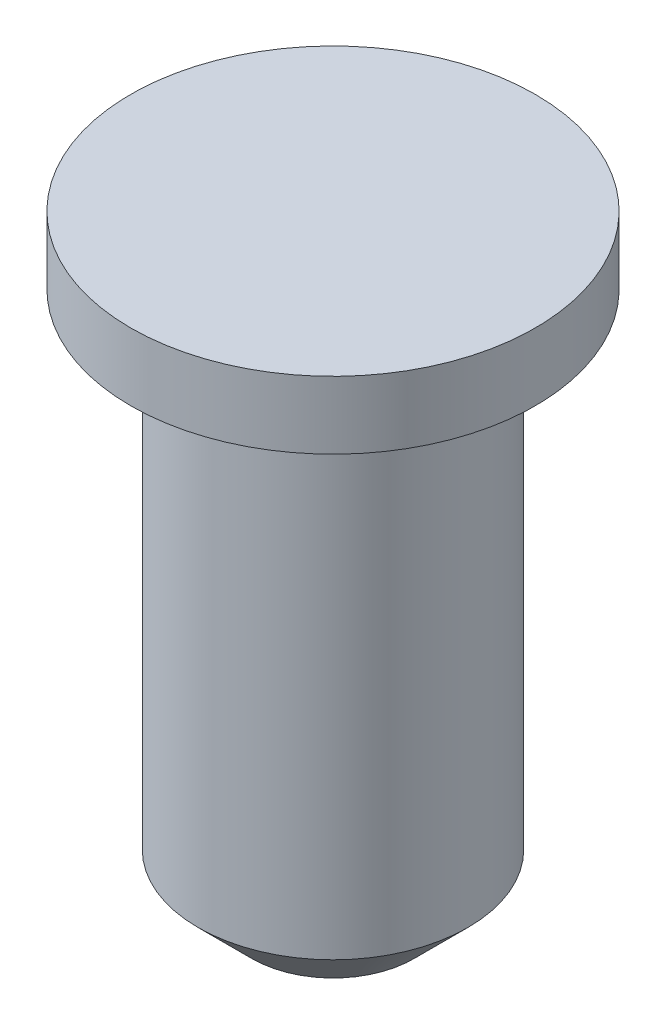
ISO-10303-21;
HEADER;
FILE_DESCRIPTION(('STEP AP214'),'2;1');
FILE_NAME('part.step','',(''),(''),'','','');
FILE_SCHEMA(('AUTOMOTIVE_DESIGN { 1 0 10303 214 1 1 1 1 }'));
ENDSEC;
DATA;
#1=APPLICATION_CONTEXT('core data for automotive mechanical design processes');
#2=APPLICATION_PROTOCOL_DEFINITION('international standard','automotive_design',2000,#1);
#3=PRODUCT_CONTEXT('',#1,'mechanical');
#4=PRODUCT('Part','Part','',(#3));
#5=PRODUCT_RELATED_PRODUCT_CATEGORY('part','',(#4));
#6=PRODUCT_DEFINITION_FORMATION('','',#4);
#7=PRODUCT_DEFINITION_CONTEXT('part definition',#1,'design');
#8=PRODUCT_DEFINITION('design','',#6,#7);
#9=PRODUCT_DEFINITION_SHAPE('','',#8);
#10=(LENGTH_UNIT() NAMED_UNIT(*) SI_UNIT(.MILLI.,.METRE.));
#11=(NAMED_UNIT(*) PLANE_ANGLE_UNIT() SI_UNIT($,.RADIAN.));
#12=(NAMED_UNIT(*) SI_UNIT($,.STERADIAN.) SOLID_ANGLE_UNIT());
#13=UNCERTAINTY_MEASURE_WITH_UNIT(LENGTH_MEASURE(1.E-05),#10,'distance_accuracy_value','');
#14=(GEOMETRIC_REPRESENTATION_CONTEXT(3) GLOBAL_UNCERTAINTY_ASSIGNED_CONTEXT((#13)) GLOBAL_UNIT_ASSIGNED_CONTEXT((#10,
#11,#12)) REPRESENTATION_CONTEXT('',''));
#15=CARTESIAN_POINT('',(0.,0.,0.));
#16=DIRECTION('',(0.,0.,1.));
#17=DIRECTION('',(1.,0.,0.));
#18=AXIS2_PLACEMENT_3D('',#15,#16,#17);
#19=CARTESIAN_POINT('',(0.,8.,0.));
#20=DIRECTION('',(0.,-1.,0.));
#21=DIRECTION('',(0.,0.,-1.));
#22=AXIS2_PLACEMENT_3D('',#19,#20,#21);
#23=CYLINDRICAL_SURFACE('',#22,2.);
#24=CARTESIAN_POINT('',(0.,0.799999999999998,0.));
#25=DIRECTION('',(0.,1.,0.));
#26=DIRECTION('',(0.,0.,1.));
#27=AXIS2_PLACEMENT_3D('',#24,#25,#26);
#28=CIRCLE('',#27,2.);
#29=CARTESIAN_POINT('',(0.,0.799999999999998,2.));
#30=VERTEX_POINT('',#29);
#31=EDGE_CURVE('E41',#30,#30,#28,.T.);
#32=ORIENTED_EDGE('',*,*,#31,.T.);
#33=EDGE_LOOP('',(#32));
#34=FACE_BOUND('',#33,.T.);
#35=CARTESIAN_POINT('',(0.,8.,0.));
#36=DIRECTION('',(0.,1.,0.));
#37=DIRECTION('',(0.,0.,1.));
#38=AXIS2_PLACEMENT_3D('',#35,#36,#37);
#39=CIRCLE('',#38,2.);
#40=CARTESIAN_POINT('',(0.,8.,2.));
#41=VERTEX_POINT('',#40);
#42=EDGE_CURVE('E45',#41,#41,#39,.T.);
#43=ORIENTED_EDGE('',*,*,#42,.F.);
#44=EDGE_LOOP('',(#43));
#45=FACE_BOUND('',#44,.T.);
#46=ADVANCED_FACE('F33',(#34,#45),#23,.T.);
#47=CARTESIAN_POINT('',(0.,0.,0.));
#48=DIRECTION('',(0.,1.,0.));
#49=DIRECTION('',(0.,0.,1.));
#50=AXIS2_PLACEMENT_3D('',#47,#48,#49);
#51=PLANE('',#50);
#52=CARTESIAN_POINT('',(0.,0.,0.));
#53=DIRECTION('',(0.,1.,0.));
#54=DIRECTION('',(0.,0.,1.));
#55=AXIS2_PLACEMENT_3D('',#52,#53,#54);
#56=CIRCLE('',#55,1.2);
#57=CARTESIAN_POINT('',(0.,0.,1.2));
#58=VERTEX_POINT('',#57);
#59=EDGE_CURVE('E10',#58,#58,#56,.F.);
#60=ORIENTED_EDGE('',*,*,#59,.T.);
#61=EDGE_LOOP('',(#60));
#62=FACE_BOUND('',#61,.T.);
#63=ADVANCED_FACE('F63',(#62),#51,.F.);
#64=CARTESIAN_POINT('',(0.,9.,0.));
#65=DIRECTION('',(0.,-1.,0.));
#66=DIRECTION('',(0.,0.,-1.));
#67=AXIS2_PLACEMENT_3D('',#64,#65,#66);
#68=CYLINDRICAL_SURFACE('',#67,3.);
#69=CARTESIAN_POINT('',(0.,9.,0.));
#70=DIRECTION('',(0.,1.,0.));
#71=DIRECTION('',(0.,0.,1.));
#72=AXIS2_PLACEMENT_3D('',#69,#70,#71);
#73=CIRCLE('',#72,3.);
#74=CARTESIAN_POINT('',(0.,9.,3.));
#75=VERTEX_POINT('',#74);
#76=EDGE_CURVE('E49',#75,#75,#73,.T.);
#77=ORIENTED_EDGE('',*,*,#76,.F.);
#78=EDGE_LOOP('',(#77));
#79=FACE_BOUND('',#78,.T.);
#80=CARTESIAN_POINT('',(0.,8.,0.));
#81=DIRECTION('',(0.,1.,0.));
#82=DIRECTION('',(0.,0.,1.));
#83=AXIS2_PLACEMENT_3D('',#80,#81,#82);
#84=CIRCLE('',#83,3.);
#85=CARTESIAN_POINT('',(0.,8.,3.));
#86=VERTEX_POINT('',#85);
#87=EDGE_CURVE('E52',#86,#86,#84,.T.);
#88=ORIENTED_EDGE('',*,*,#87,.T.);
#89=EDGE_LOOP('',(#88));
#90=FACE_BOUND('',#89,.T.);
#91=ADVANCED_FACE('F60',(#79,#90),#68,.T.);
#92=CARTESIAN_POINT('',(0.,9.,0.));
#93=DIRECTION('',(0.,1.,0.));
#94=DIRECTION('',(0.,0.,1.));
#95=AXIS2_PLACEMENT_3D('',#92,#93,#94);
#96=PLANE('',#95);
#97=ORIENTED_EDGE('',*,*,#76,.T.);
#98=EDGE_LOOP('',(#97));
#99=FACE_BOUND('',#98,.T.);
#100=ADVANCED_FACE('F58',(#99),#96,.T.);
#101=CARTESIAN_POINT('',(0.,8.,0.));
#102=DIRECTION('',(0.,1.,0.));
#103=DIRECTION('',(0.,0.,1.));
#104=AXIS2_PLACEMENT_3D('',#101,#102,#103);
#105=PLANE('',#104);
#106=ORIENTED_EDGE('',*,*,#42,.T.);
#107=EDGE_LOOP('',(#106));
#108=FACE_BOUND('',#107,.T.);
#109=ORIENTED_EDGE('',*,*,#87,.F.);
#110=EDGE_LOOP('',(#109));
#111=FACE_BOUND('',#110,.T.);
#112=ADVANCED_FACE('F67',(#108,#111),#105,.F.);
#113=CARTESIAN_POINT('',(0.,0.799999999999998,0.));
#114=DIRECTION('',(0.,1.,0.));
#115=DIRECTION('',(0.,0.,1.));
#116=AXIS2_PLACEMENT_3D('',#113,#114,#115);
#117=CONICAL_SURFACE('',#116,2.,0.78539816339745);
#118=CARTESIAN_POINT('',(0.,0.,1.2));
#119=CARTESIAN_POINT('',(0.,0.00833333333333311,1.20833333333333));
#120=CARTESIAN_POINT('',(0.,0.0166666666666665,1.21666666666667));
#121=CARTESIAN_POINT('',(0.,0.0333333333333332,1.23333333333333));
#122=CARTESIAN_POINT('',(0.,0.0416666666666665,1.24166666666667));
#123=CARTESIAN_POINT('',(0.,0.0583333333333331,1.25833333333333));
#124=CARTESIAN_POINT('',(0.,0.0666666666666664,1.26666666666667));
#125=CARTESIAN_POINT('',(0.,0.083333333333333,1.28333333333333));
#126=CARTESIAN_POINT('',(0.,0.0916666666666663,1.29166666666667));
#127=CARTESIAN_POINT('',(0.,0.108333333333333,1.30833333333333));
#128=CARTESIAN_POINT('',(0.,0.116666666666666,1.31666666666667));
#129=CARTESIAN_POINT('',(0.,0.133333333333333,1.33333333333333));
#130=CARTESIAN_POINT('',(0.,0.141666666666666,1.34166666666667));
#131=CARTESIAN_POINT('',(0.,0.158333333333333,1.35833333333333));
#132=CARTESIAN_POINT('',(0.,0.166666666666666,1.36666666666667));
#133=CARTESIAN_POINT('',(0.,0.183333333333333,1.38333333333333));
#134=CARTESIAN_POINT('',(0.,0.191666666666666,1.39166666666667));
#135=CARTESIAN_POINT('',(0.,0.208333333333333,1.40833333333333));
#136=CARTESIAN_POINT('',(0.,0.216666666666666,1.41666666666667));
#137=CARTESIAN_POINT('',(0.,0.233333333333333,1.43333333333333));
#138=CARTESIAN_POINT('',(0.,0.241666666666666,1.44166666666667));
#139=CARTESIAN_POINT('',(0.,0.258333333333332,1.45833333333333));
#140=CARTESIAN_POINT('',(0.,0.266666666666666,1.46666666666667));
#141=CARTESIAN_POINT('',(0.,0.283333333333332,1.48333333333333));
#142=CARTESIAN_POINT('',(0.,0.291666666666666,1.49166666666667));
#143=CARTESIAN_POINT('',(0.,0.308333333333332,1.50833333333333));
#144=CARTESIAN_POINT('',(0.,0.316666666666666,1.51666666666667));
#145=CARTESIAN_POINT('',(0.,0.333333333333332,1.53333333333333));
#146=CARTESIAN_POINT('',(0.,0.341666666666666,1.54166666666667));
#147=CARTESIAN_POINT('',(0.,0.358333333333332,1.55833333333333));
#148=CARTESIAN_POINT('',(0.,0.366666666666666,1.56666666666667));
#149=CARTESIAN_POINT('',(0.,0.383333333333332,1.58333333333333));
#150=CARTESIAN_POINT('',(0.,0.391666666666665,1.59166666666667));
#151=CARTESIAN_POINT('',(0.,0.408333333333332,1.60833333333333));
#152=CARTESIAN_POINT('',(0.,0.416666666666665,1.61666666666667));
#153=CARTESIAN_POINT('',(0.,0.433333333333332,1.63333333333333));
#154=CARTESIAN_POINT('',(0.,0.441666666666665,1.64166666666667));
#155=CARTESIAN_POINT('',(0.,0.458333333333332,1.65833333333333));
#156=CARTESIAN_POINT('',(0.,0.466666666666665,1.66666666666667));
#157=CARTESIAN_POINT('',(0.,0.483333333333332,1.68333333333333));
#158=CARTESIAN_POINT('',(0.,0.491666666666665,1.69166666666667));
#159=CARTESIAN_POINT('',(0.,0.508333333333332,1.70833333333333));
#160=CARTESIAN_POINT('',(0.,0.516666666666665,1.71666666666667));
#161=CARTESIAN_POINT('',(0.,0.533333333333332,1.73333333333333));
#162=CARTESIAN_POINT('',(0.,0.541666666666665,1.74166666666667));
#163=CARTESIAN_POINT('',(0.,0.558333333333332,1.75833333333333));
#164=CARTESIAN_POINT('',(0.,0.566666666666665,1.76666666666667));
#165=CARTESIAN_POINT('',(0.,0.583333333333331,1.78333333333333));
#166=CARTESIAN_POINT('',(0.,0.591666666666665,1.79166666666667));
#167=CARTESIAN_POINT('',(0.,0.608333333333332,1.80833333333333));
#168=CARTESIAN_POINT('',(0.,0.616666666666665,1.81666666666667));
#169=CARTESIAN_POINT('',(0.,0.633333333333331,1.83333333333333));
#170=CARTESIAN_POINT('',(0.,0.641666666666665,1.84166666666667));
#171=CARTESIAN_POINT('',(0.,0.658333333333331,1.85833333333333));
#172=CARTESIAN_POINT('',(0.,0.666666666666665,1.86666666666667));
#173=CARTESIAN_POINT('',(0.,0.683333333333331,1.88333333333333));
#174=CARTESIAN_POINT('',(0.,0.691666666666665,1.89166666666667));
#175=CARTESIAN_POINT('',(0.,0.708333333333331,1.90833333333333));
#176=CARTESIAN_POINT('',(0.,0.716666666666665,1.91666666666667));
#177=CARTESIAN_POINT('',(0.,0.733333333333331,1.93333333333333));
#178=CARTESIAN_POINT('',(0.,0.741666666666664,1.94166666666667));
#179=CARTESIAN_POINT('',(0.,0.758333333333331,1.95833333333333));
#180=CARTESIAN_POINT('',(0.,0.766666666666664,1.96666666666667));
#181=CARTESIAN_POINT('',(0.,0.783333333333331,1.98333333333333));
#182=CARTESIAN_POINT('',(0.,0.791666666666664,1.99166666666667));
#183=CARTESIAN_POINT('',(0.,0.799999999999998,2.));
#184=B_SPLINE_CURVE_WITH_KNOTS('',3,(#118,#119,#120,#121,#122,#123,#124,#125,#126,#127,#128,
#129,#130,#131,#132,#133,#134,#135,#136,#137,#138,#139,#140,#141,#142,#143,#144,#145,#146,#147,
#148,#149,#150,#151,#152,#153,#154,#155,#156,#157,#158,#159,#160,#161,#162,#163,#164,#165,#166,
#167,#168,#169,#170,#171,#172,#173,#174,#175,#176,#177,#178,#179,#180,#181,#182,#183),
.UNSPECIFIED.,.F.,.F.,(4,2,2,2,2,2,2,2,2,2,2,2,2,2,2,2,2,2,2,2,2,2,2,2,2,2,2,2,2,2,2,2,4),(0.,
0.0353553390593275,0.0707106781186548,0.106066017177982,0.14142135623731,0.176776695296637,
0.212132034355964,0.247487373415292,0.282842712474619,0.318198051533946,0.353553390593274,
0.388908729652601,0.424264068711929,0.459619407771256,0.494974746830583,0.53033008588991,
0.565685424949238,0.601040764008565,0.636396103067893,0.67175144212722,0.707106781186547,
0.742462120245875,0.777817459305202,0.813172798364529,0.848528137423857,0.883883476483184,
0.919238815542512,0.954594154601839,0.989949493661166,1.02530483272049,1.06066017177982,
1.09601551083915,1.13137084989848),.UNSPECIFIED.);
#185=EDGE_CURVE('BSEAM36',#58,#30,#184,.T.);
#186=ORIENTED_EDGE('',*,*,#59,.F.);
#187=ORIENTED_EDGE('',*,*,#31,.F.);
#188=ORIENTED_EDGE('',*,*,#185,.T.);
#189=ORIENTED_EDGE('',*,*,#185,.F.);
#190=EDGE_LOOP('',(#186,#188,#187,#189));
#191=FACE_BOUND('',#190,.T.);
#192=ADVANCED_FACE('F36',(#191),#117,.T.);
#193=CLOSED_SHELL('',(#46,#63,#91,#100,#112,#192));
#194=MANIFOLD_SOLID_BREP('B2',#193);
#195=ADVANCED_BREP_SHAPE_REPRESENTATION('',(#18,#194),#14);
#196=SHAPE_DEFINITION_REPRESENTATION(#9,#195);
ENDSEC;
END-ISO-10303-21;
